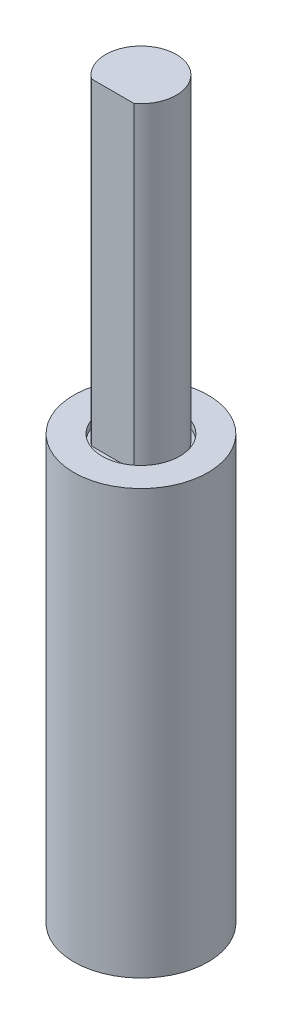
ISO-10303-21;
HEADER;
FILE_DESCRIPTION(('STEP AP214'),'2;1');
FILE_NAME('part.step','',(''),(''),'','','');
FILE_SCHEMA(('AUTOMOTIVE_DESIGN { 1 0 10303 214 1 1 1 1 }'));
ENDSEC;
DATA;
#1=APPLICATION_CONTEXT('core data for automotive mechanical design processes');
#2=APPLICATION_PROTOCOL_DEFINITION('international standard','automotive_design',2000,#1);
#3=PRODUCT_CONTEXT('',#1,'mechanical');
#4=PRODUCT('Part','Part','',(#3));
#5=PRODUCT_RELATED_PRODUCT_CATEGORY('part','',(#4));
#6=PRODUCT_DEFINITION_FORMATION('','',#4);
#7=PRODUCT_DEFINITION_CONTEXT('part definition',#1,'design');
#8=PRODUCT_DEFINITION('design','',#6,#7);
#9=PRODUCT_DEFINITION_SHAPE('','',#8);
#10=(LENGTH_UNIT() NAMED_UNIT(*) SI_UNIT(.MILLI.,.METRE.));
#11=(NAMED_UNIT(*) PLANE_ANGLE_UNIT() SI_UNIT($,.RADIAN.));
#12=(NAMED_UNIT(*) SI_UNIT($,.STERADIAN.) SOLID_ANGLE_UNIT());
#13=UNCERTAINTY_MEASURE_WITH_UNIT(LENGTH_MEASURE(1.E-05),#10,'distance_accuracy_value','');
#14=(GEOMETRIC_REPRESENTATION_CONTEXT(3) GLOBAL_UNCERTAINTY_ASSIGNED_CONTEXT((#13)) GLOBAL_UNIT_ASSIGNED_CONTEXT((#10,
#11,#12)) REPRESENTATION_CONTEXT('',''));
#15=CARTESIAN_POINT('',(0.,0.,0.));
#16=DIRECTION('',(0.,0.,1.));
#17=DIRECTION('',(1.,0.,0.));
#18=AXIS2_PLACEMENT_3D('',#15,#16,#17);
#19=CARTESIAN_POINT('',(0.,52.,0.));
#20=DIRECTION('',(0.,-1.,0.));
#21=DIRECTION('',(0.,0.,-1.));
#22=AXIS2_PLACEMENT_3D('',#19,#20,#21);
#23=CYLINDRICAL_SURFACE('',#22,2.5);
#24=DIRECTION('',(0.,1.,0.));
#25=VECTOR('',#24,1.);
#26=CARTESIAN_POINT('',(-1.5,29.5,2.));
#27=LINE('',#26,#25);
#28=CARTESIAN_POINT('',(-1.5,29.5,2.));
#29=VERTEX_POINT('',#28);
#30=CARTESIAN_POINT('',(-1.5,52.,2.));
#31=VERTEX_POINT('',#30);
#32=EDGE_CURVE('E75',#29,#31,#27,.T.);
#33=ORIENTED_EDGE('',*,*,#32,.T.);
#34=CARTESIAN_POINT('',(0.,52.,0.));
#35=DIRECTION('',(0.,1.,0.));
#36=DIRECTION('',(0.,0.,1.));
#37=AXIS2_PLACEMENT_3D('',#34,#35,#36);
#38=CIRCLE('',#37,2.5);
#39=CARTESIAN_POINT('',(1.5,52.,2.));
#40=VERTEX_POINT('',#39);
#41=EDGE_CURVE('E83',#40,#31,#38,.T.);
#42=ORIENTED_EDGE('',*,*,#41,.F.);
#43=DIRECTION('',(0.,1.,0.));
#44=VECTOR('',#43,1.);
#45=CARTESIAN_POINT('',(1.5,29.5,2.));
#46=LINE('',#45,#44);
#47=CARTESIAN_POINT('',(1.5,29.5,2.));
#48=VERTEX_POINT('',#47);
#49=EDGE_CURVE('E63',#48,#40,#46,.T.);
#50=ORIENTED_EDGE('',*,*,#49,.F.);
#51=CARTESIAN_POINT('',(0.,29.5,0.));
#52=DIRECTION('',(0.,1.,0.));
#53=DIRECTION('',(0.,0.,1.));
#54=AXIS2_PLACEMENT_3D('',#51,#52,#53);
#55=CIRCLE('',#54,2.5);
#56=EDGE_CURVE('E85',#48,#29,#55,.T.);
#57=ORIENTED_EDGE('',*,*,#56,.T.);
#58=EDGE_LOOP('',(#33,#42,#50,#57));
#59=FACE_BOUND('',#58,.T.);
#60=ADVANCED_FACE('F45',(#59),#23,.T.);
#61=CARTESIAN_POINT('',(0.,52.,0.));
#62=DIRECTION('',(0.,1.,0.));
#63=DIRECTION('',(0.,0.,1.));
#64=AXIS2_PLACEMENT_3D('',#61,#62,#63);
#65=PLANE('',#64);
#66=ORIENTED_EDGE('',*,*,#41,.T.);
#67=DIRECTION('',(1.,0.,0.));
#68=VECTOR('',#67,1.);
#69=CARTESIAN_POINT('',(0.,52.,2.));
#70=LINE('',#69,#68);
#71=EDGE_CURVE('E72',#31,#40,#70,.T.);
#72=ORIENTED_EDGE('',*,*,#71,.T.);
#73=EDGE_LOOP('',(#66,#72));
#74=FACE_BOUND('',#73,.T.);
#75=ADVANCED_FACE('F88',(#74),#65,.T.);
#76=CARTESIAN_POINT('',(0.,30.,0.));
#77=DIRECTION('',(0.,-1.,0.));
#78=DIRECTION('',(0.,0.,-1.));
#79=AXIS2_PLACEMENT_3D('',#76,#77,#78);
#80=CYLINDRICAL_SURFACE('',#79,4.75);
#81=CARTESIAN_POINT('',(0.,30.,0.));
#82=DIRECTION('',(0.,1.,0.));
#83=DIRECTION('',(0.,0.,1.));
#84=AXIS2_PLACEMENT_3D('',#81,#82,#83);
#85=CIRCLE('',#84,4.75);
#86=CARTESIAN_POINT('',(0.,30.,4.75));
#87=VERTEX_POINT('',#86);
#88=EDGE_CURVE('E55',#87,#87,#85,.T.);
#89=ORIENTED_EDGE('',*,*,#88,.F.);
#90=EDGE_LOOP('',(#89));
#91=FACE_BOUND('',#90,.T.);
#92=CARTESIAN_POINT('',(0.,0.,0.));
#93=DIRECTION('',(0.,1.,0.));
#94=DIRECTION('',(0.,0.,1.));
#95=AXIS2_PLACEMENT_3D('',#92,#93,#94);
#96=CIRCLE('',#95,4.75);
#97=CARTESIAN_POINT('',(0.,0.,4.75));
#98=VERTEX_POINT('',#97);
#99=EDGE_CURVE('E49',#98,#98,#96,.T.);
#100=ORIENTED_EDGE('',*,*,#99,.T.);
#101=EDGE_LOOP('',(#100));
#102=FACE_BOUND('',#101,.T.);
#103=ADVANCED_FACE('F47',(#91,#102),#80,.T.);
#104=CARTESIAN_POINT('',(0.,30.,0.));
#105=DIRECTION('',(0.,1.,0.));
#106=DIRECTION('',(0.,0.,1.));
#107=AXIS2_PLACEMENT_3D('',#104,#105,#106);
#108=PLANE('',#107);
#109=CARTESIAN_POINT('',(0.,30.,0.));
#110=DIRECTION('',(0.,1.,0.));
#111=DIRECTION('',(0.,0.,1.));
#112=AXIS2_PLACEMENT_3D('',#109,#110,#111);
#113=CIRCLE('',#112,2.75);
#114=CARTESIAN_POINT('',(0.,30.,2.75));
#115=VERTEX_POINT('',#114);
#116=EDGE_CURVE('E90',#115,#115,#113,.T.);
#117=ORIENTED_EDGE('',*,*,#116,.F.);
#118=EDGE_LOOP('',(#117));
#119=FACE_BOUND('',#118,.T.);
#120=ORIENTED_EDGE('',*,*,#88,.T.);
#121=EDGE_LOOP('',(#120));
#122=FACE_BOUND('',#121,.T.);
#123=ADVANCED_FACE('F115',(#119,#122),#108,.T.);
#124=CARTESIAN_POINT('',(0.,0.,0.));
#125=DIRECTION('',(0.,1.,0.));
#126=DIRECTION('',(0.,0.,1.));
#127=AXIS2_PLACEMENT_3D('',#124,#125,#126);
#128=PLANE('',#127);
#129=CARTESIAN_POINT('',(0.,0.,0.));
#130=DIRECTION('',(0.,-1.,0.));
#131=DIRECTION('',(0.,0.,-1.));
#132=AXIS2_PLACEMENT_3D('',#129,#130,#131);
#133=CIRCLE('',#132,2.5);
#134=CARTESIAN_POINT('',(0.,0.,-2.5));
#135=VERTEX_POINT('',#134);
#136=EDGE_CURVE('E11',#135,#135,#133,.T.);
#137=ORIENTED_EDGE('',*,*,#136,.F.);
#138=EDGE_LOOP('',(#137));
#139=FACE_BOUND('',#138,.T.);
#140=ORIENTED_EDGE('',*,*,#99,.F.);
#141=EDGE_LOOP('',(#140));
#142=FACE_BOUND('',#141,.T.);
#143=ADVANCED_FACE('F112',(#139,#142),#128,.F.);
#144=CARTESIAN_POINT('',(0.,29.5,0.));
#145=DIRECTION('',(0.,1.,0.));
#146=DIRECTION('',(0.,0.,1.));
#147=AXIS2_PLACEMENT_3D('',#144,#145,#146);
#148=CYLINDRICAL_SURFACE('',#147,2.75);
#149=CARTESIAN_POINT('',(0.,29.5,0.));
#150=DIRECTION('',(0.,1.,0.));
#151=DIRECTION('',(0.,0.,1.));
#152=AXIS2_PLACEMENT_3D('',#149,#150,#151);
#153=CIRCLE('',#152,2.75);
#154=CARTESIAN_POINT('',(0.,29.5,2.75));
#155=VERTEX_POINT('',#154);
#156=EDGE_CURVE('E95',#155,#155,#153,.T.);
#157=ORIENTED_EDGE('',*,*,#156,.F.);
#158=EDGE_LOOP('',(#157));
#159=FACE_BOUND('',#158,.T.);
#160=ORIENTED_EDGE('',*,*,#116,.T.);
#161=EDGE_LOOP('',(#160));
#162=FACE_BOUND('',#161,.T.);
#163=ADVANCED_FACE('F114',(#159,#162),#148,.F.);
#164=CARTESIAN_POINT('',(0.,29.5,0.));
#165=DIRECTION('',(0.,1.,0.));
#166=DIRECTION('',(0.,0.,1.));
#167=AXIS2_PLACEMENT_3D('',#164,#165,#166);
#168=PLANE('',#167);
#169=ORIENTED_EDGE('',*,*,#56,.F.);
#170=DIRECTION('',(1.,0.,0.));
#171=VECTOR('',#170,1.);
#172=CARTESIAN_POINT('',(0.,29.5,2.));
#173=LINE('',#172,#171);
#174=EDGE_CURVE('E69',#29,#48,#173,.T.);
#175=ORIENTED_EDGE('',*,*,#174,.F.);
#176=EDGE_LOOP('',(#169,#175));
#177=FACE_BOUND('',#176,.T.);
#178=ORIENTED_EDGE('',*,*,#156,.T.);
#179=EDGE_LOOP('',(#178));
#180=FACE_BOUND('',#179,.T.);
#181=ADVANCED_FACE('F121',(#177,#180),#168,.T.);
#182=CARTESIAN_POINT('',(0.,-0.5,0.));
#183=DIRECTION('',(0.,1.,0.));
#184=DIRECTION('',(0.,0.,1.));
#185=AXIS2_PLACEMENT_3D('',#182,#183,#184);
#186=CYLINDRICAL_SURFACE('',#185,2.5);
#187=CARTESIAN_POINT('',(0.,-0.5,0.));
#188=DIRECTION('',(0.,-1.,0.));
#189=DIRECTION('',(0.,0.,-1.));
#190=AXIS2_PLACEMENT_3D('',#187,#188,#189);
#191=CIRCLE('',#190,2.5);
#192=CARTESIAN_POINT('',(0.,-0.5,-2.5));
#193=VERTEX_POINT('',#192);
#194=EDGE_CURVE('E97',#193,#193,#191,.T.);
#195=ORIENTED_EDGE('',*,*,#194,.F.);
#196=EDGE_LOOP('',(#195));
#197=FACE_BOUND('',#196,.T.);
#198=ORIENTED_EDGE('',*,*,#136,.T.);
#199=EDGE_LOOP('',(#198));
#200=FACE_BOUND('',#199,.T.);
#201=ADVANCED_FACE('F136',(#197,#200),#186,.T.);
#202=CARTESIAN_POINT('',(0.,-0.5,0.));
#203=DIRECTION('',(0.,-1.,0.));
#204=DIRECTION('',(0.,0.,-1.));
#205=AXIS2_PLACEMENT_3D('',#202,#203,#204);
#206=PLANE('',#205);
#207=ORIENTED_EDGE('',*,*,#194,.T.);
#208=EDGE_LOOP('',(#207));
#209=FACE_BOUND('',#208,.T.);
#210=ADVANCED_FACE('F141',(#209),#206,.T.);
#211=CARTESIAN_POINT('',(0.,29.5,2.));
#212=DIRECTION('',(0.,0.,1.));
#213=DIRECTION('',(1.,0.,0.));
#214=AXIS2_PLACEMENT_3D('',#211,#212,#213);
#215=PLANE('',#214);
#216=ORIENTED_EDGE('',*,*,#71,.F.);
#217=ORIENTED_EDGE('',*,*,#32,.F.);
#218=ORIENTED_EDGE('',*,*,#174,.T.);
#219=ORIENTED_EDGE('',*,*,#49,.T.);
#220=EDGE_LOOP('',(#216,#217,#218,#219));
#221=FACE_BOUND('',#220,.T.);
#222=ADVANCED_FACE('F74',(#221),#215,.T.);
#223=CLOSED_SHELL('',(#60,#75,#103,#123,#143,#163,#181,#201,#210,#222));
#224=MANIFOLD_SOLID_BREP('B2',#223);
#225=ADVANCED_BREP_SHAPE_REPRESENTATION('',(#18,#224),#14);
#226=SHAPE_DEFINITION_REPRESENTATION(#9,#225);
ENDSEC;
END-ISO-10303-21;
